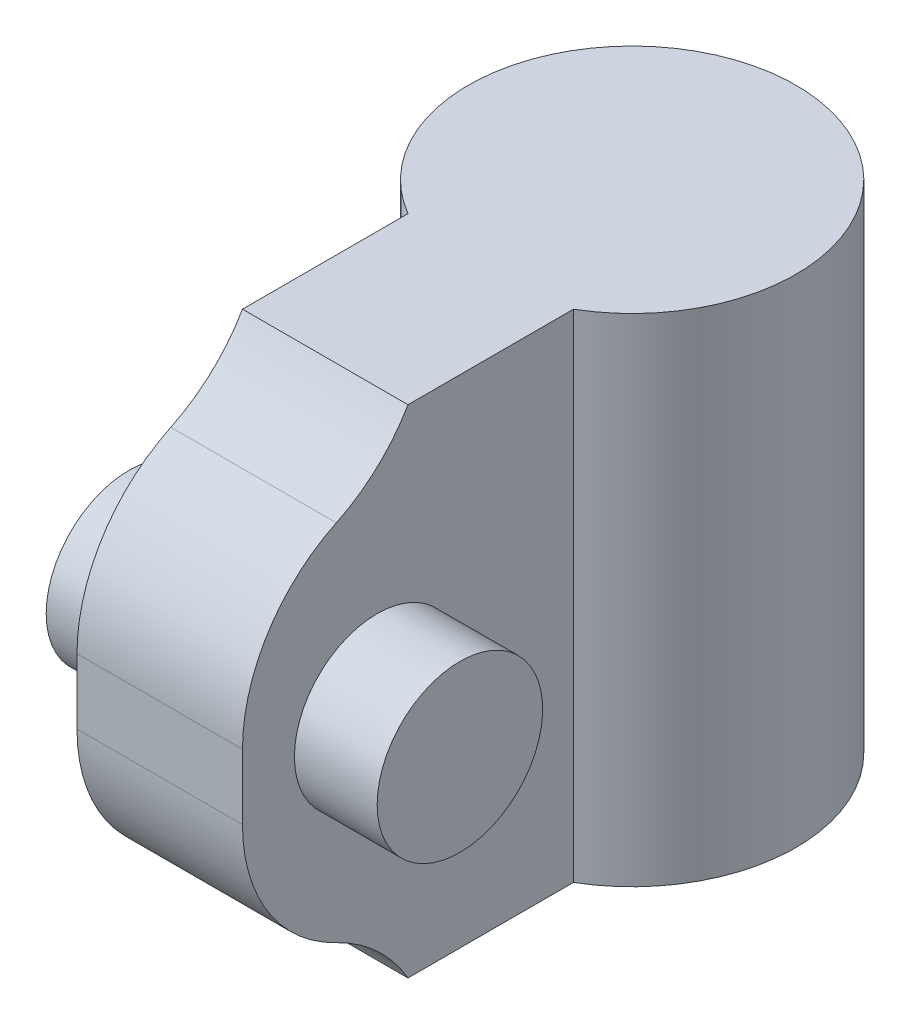
ISO-10303-21;
HEADER;
FILE_DESCRIPTION(('STEP AP214'),'2;1');
FILE_NAME('part.step','',(''),(''),'','','');
FILE_SCHEMA(('AUTOMOTIVE_DESIGN { 1 0 10303 214 1 1 1 1 }'));
ENDSEC;
DATA;
#1=APPLICATION_CONTEXT('core data for automotive mechanical design processes');
#2=APPLICATION_PROTOCOL_DEFINITION('international standard','automotive_design',2000,#1);
#3=PRODUCT_CONTEXT('',#1,'mechanical');
#4=PRODUCT('Part','Part','',(#3));
#5=PRODUCT_RELATED_PRODUCT_CATEGORY('part','',(#4));
#6=PRODUCT_DEFINITION_FORMATION('','',#4);
#7=PRODUCT_DEFINITION_CONTEXT('part definition',#1,'design');
#8=PRODUCT_DEFINITION('design','',#6,#7);
#9=PRODUCT_DEFINITION_SHAPE('','',#8);
#10=(LENGTH_UNIT() NAMED_UNIT(*) SI_UNIT(.MILLI.,.METRE.));
#11=(NAMED_UNIT(*) PLANE_ANGLE_UNIT() SI_UNIT($,.RADIAN.));
#12=(NAMED_UNIT(*) SI_UNIT($,.STERADIAN.) SOLID_ANGLE_UNIT());
#13=UNCERTAINTY_MEASURE_WITH_UNIT(LENGTH_MEASURE(1.E-05),#10,'distance_accuracy_value','');
#14=(GEOMETRIC_REPRESENTATION_CONTEXT(3) GLOBAL_UNCERTAINTY_ASSIGNED_CONTEXT((#13)) GLOBAL_UNIT_ASSIGNED_CONTEXT((#10,
#11,#12)) REPRESENTATION_CONTEXT('',''));
#15=CARTESIAN_POINT('',(0.,0.,0.));
#16=DIRECTION('',(0.,0.,1.));
#17=DIRECTION('',(1.,0.,0.));
#18=AXIS2_PLACEMENT_3D('',#15,#16,#17);
#19=CARTESIAN_POINT('',(2.5,0.,14.2722944655068));
#20=DIRECTION('',(0.,0.,1.));
#21=DIRECTION('',(1.,0.,0.));
#22=AXIS2_PLACEMENT_3D('',#19,#20,#21);
#23=PLANE('',#22);
#24=DIRECTION('',(0.,-1.,0.));
#25=VECTOR('',#24,1.);
#26=CARTESIAN_POINT('',(2.5,0.,14.2722944655068));
#27=LINE('',#26,#25);
#28=CARTESIAN_POINT('',(2.5,-6.51387818865997,14.2722944655068));
#29=VERTEX_POINT('',#28);
#30=CARTESIAN_POINT('',(2.5,-8.48612181134003,14.2722944655068));
#31=VERTEX_POINT('',#30);
#32=EDGE_CURVE('E155',#29,#31,#27,.T.);
#33=ORIENTED_EDGE('',*,*,#32,.F.);
#34=DIRECTION('',(1.,0.,0.));
#35=VECTOR('',#34,1.);
#36=CARTESIAN_POINT('',(-4.95,-6.51387818865997,14.2722944655068));
#37=LINE('',#36,#35);
#38=CARTESIAN_POINT('',(-2.5,-6.51387818865997,14.2722944655068));
#39=VERTEX_POINT('',#38);
#40=EDGE_CURVE('E109',#39,#29,#37,.T.);
#41=ORIENTED_EDGE('',*,*,#40,.F.);
#42=DIRECTION('',(0.,-1.,0.));
#43=VECTOR('',#42,1.);
#44=CARTESIAN_POINT('',(-2.5,0.,14.2722944655068));
#45=LINE('',#44,#43);
#46=CARTESIAN_POINT('',(-2.5,-8.48612181134003,14.2722944655068));
#47=VERTEX_POINT('',#46);
#48=EDGE_CURVE('E148',#39,#47,#45,.T.);
#49=ORIENTED_EDGE('',*,*,#48,.T.);
#50=DIRECTION('',(1.,0.,0.));
#51=VECTOR('',#50,1.);
#52=CARTESIAN_POINT('',(-4.95,-8.48612181134003,14.2722944655068));
#53=LINE('',#52,#51);
#54=EDGE_CURVE('E135',#47,#31,#53,.T.);
#55=ORIENTED_EDGE('',*,*,#54,.T.);
#56=EDGE_LOOP('',(#33,#41,#49,#55));
#57=FACE_BOUND('',#56,.T.);
#58=ADVANCED_FACE('F39',(#57),#23,.T.);
#59=CARTESIAN_POINT('',(2.5,0.,4.27229446550679));
#60=DIRECTION('',(1.,0.,0.));
#61=DIRECTION('',(0.,0.,-1.));
#62=AXIS2_PLACEMENT_3D('',#59,#60,#61);
#63=PLANE('',#62);
#64=CARTESIAN_POINT('',(2.5,-7.5,10.203329527437));
#65=DIRECTION('',(1.,0.,0.));
#66=DIRECTION('',(0.,0.,-1.));
#67=AXIS2_PLACEMENT_3D('',#64,#65,#66);
#68=CIRCLE('',#67,2.5);
#69=CARTESIAN_POINT('',(2.5,-7.5,7.70332952743702));
#70=VERTEX_POINT('',#69);
#71=EDGE_CURVE('E11',#70,#70,#68,.T.);
#72=ORIENTED_EDGE('',*,*,#71,.F.);
#73=EDGE_LOOP('',(#72));
#74=FACE_BOUND('',#73,.T.);
#75=CARTESIAN_POINT('',(2.5,-6.51387818865997,9.2722944655068));
#76=DIRECTION('',(-1.,0.,0.));
#77=DIRECTION('',(0.,0.,1.));
#78=AXIS2_PLACEMENT_3D('',#75,#76,#77);
#79=CIRCLE('',#78,5.);
#80=CARTESIAN_POINT('',(2.5,-2.00693909432999,11.4373579749679));
#81=VERTEX_POINT('',#80);
#82=EDGE_CURVE('E112',#29,#81,#79,.T.);
#83=ORIENTED_EDGE('',*,*,#82,.F.);
#84=ORIENTED_EDGE('',*,*,#32,.T.);
#85=CARTESIAN_POINT('',(2.5,-8.48612181134003,9.2722944655068));
#86=DIRECTION('',(-1.,0.,0.));
#87=DIRECTION('',(0.,0.,1.));
#88=AXIS2_PLACEMENT_3D('',#85,#86,#87);
#89=CIRCLE('',#88,4.99999999999999);
#90=CARTESIAN_POINT('',(2.5,-12.99306090567,11.4373579749679));
#91=VERTEX_POINT('',#90);
#92=EDGE_CURVE('E131',#91,#31,#89,.T.);
#93=ORIENTED_EDGE('',*,*,#92,.F.);
#94=CARTESIAN_POINT('',(2.5,-17.5,13.602421484429));
#95=DIRECTION('',(1.,0.,0.));
#96=DIRECTION('',(0.,0.,-1.));
#97=AXIS2_PLACEMENT_3D('',#94,#95,#96);
#98=CIRCLE('',#97,5.00000000000001);
#99=CARTESIAN_POINT('',(2.5,-15.,9.2722944655068));
#100=VERTEX_POINT('',#99);
#101=EDGE_CURVE('E128',#100,#91,#98,.T.);
#102=ORIENTED_EDGE('',*,*,#101,.F.);
#103=DIRECTION('',(0.,0.,1.));
#104=VECTOR('',#103,1.);
#105=CARTESIAN_POINT('',(2.5,-15.,4.27229446550679));
#106=LINE('',#105,#104);
#107=CARTESIAN_POINT('',(2.5,-15.,4.2722944655068));
#108=VERTEX_POINT('',#107);
#109=EDGE_CURVE('E144',#108,#100,#106,.T.);
#110=ORIENTED_EDGE('',*,*,#109,.F.);
#111=DIRECTION('',(0.,-1.,0.));
#112=VECTOR('',#111,1.);
#113=CARTESIAN_POINT('',(2.5,0.,4.2722944655068));
#114=LINE('',#113,#112);
#115=CARTESIAN_POINT('',(2.5,0.,4.2722944655068));
#116=VERTEX_POINT('',#115);
#117=EDGE_CURVE('E158',#116,#108,#114,.T.);
#118=ORIENTED_EDGE('',*,*,#117,.F.);
#119=DIRECTION('',(0.,0.,1.));
#120=VECTOR('',#119,1.);
#121=CARTESIAN_POINT('',(2.5,0.,4.27229446550679));
#122=LINE('',#121,#120);
#123=CARTESIAN_POINT('',(2.5,0.,9.2722944655068));
#124=VERTEX_POINT('',#123);
#125=EDGE_CURVE('E122',#116,#124,#122,.T.);
#126=ORIENTED_EDGE('',*,*,#125,.T.);
#127=CARTESIAN_POINT('',(2.5,2.5,13.602421484429));
#128=DIRECTION('',(1.,0.,0.));
#129=DIRECTION('',(0.,0.,-1.));
#130=AXIS2_PLACEMENT_3D('',#127,#128,#129);
#131=CIRCLE('',#130,5.);
#132=EDGE_CURVE('E53',#81,#124,#131,.T.);
#133=ORIENTED_EDGE('',*,*,#132,.F.);
#134=EDGE_LOOP('',(#83,#84,#93,#102,#110,#118,#126,#133));
#135=FACE_BOUND('',#134,.T.);
#136=ADVANCED_FACE('F120',(#74,#135),#63,.T.);
#137=CARTESIAN_POINT('',(0.,0.,0.));
#138=DIRECTION('',(0.,-1.,0.));
#139=DIRECTION('',(0.,0.,-1.));
#140=AXIS2_PLACEMENT_3D('',#137,#138,#139);
#141=CYLINDRICAL_SURFACE('',#140,4.95);
#142=CARTESIAN_POINT('',(0.,-15.,0.));
#143=DIRECTION('',(0.,-1.,0.));
#144=DIRECTION('',(0.,0.,-1.));
#145=AXIS2_PLACEMENT_3D('',#142,#143,#144);
#146=CIRCLE('',#145,4.95);
#147=CARTESIAN_POINT('',(-2.5,-15.,4.27229446550679));
#148=VERTEX_POINT('',#147);
#149=EDGE_CURVE('E150',#148,#108,#146,.T.);
#150=ORIENTED_EDGE('',*,*,#149,.F.);
#151=DIRECTION('',(0.,-1.,0.));
#152=VECTOR('',#151,1.);
#153=CARTESIAN_POINT('',(-2.5,0.,4.27229446550679));
#154=LINE('',#153,#152);
#155=CARTESIAN_POINT('',(-2.5,0.,4.27229446550679));
#156=VERTEX_POINT('',#155);
#157=EDGE_CURVE('E160',#156,#148,#154,.T.);
#158=ORIENTED_EDGE('',*,*,#157,.F.);
#159=CARTESIAN_POINT('',(0.,0.,0.));
#160=DIRECTION('',(0.,-1.,0.));
#161=DIRECTION('',(0.,0.,-1.));
#162=AXIS2_PLACEMENT_3D('',#159,#160,#161);
#163=CIRCLE('',#162,4.95);
#164=EDGE_CURVE('E143',#156,#116,#163,.T.);
#165=ORIENTED_EDGE('',*,*,#164,.T.);
#166=ORIENTED_EDGE('',*,*,#117,.T.);
#167=EDGE_LOOP('',(#150,#158,#165,#166));
#168=FACE_BOUND('',#167,.T.);
#169=ADVANCED_FACE('F180',(#168),#141,.T.);
#170=CARTESIAN_POINT('',(-2.5,0.,14.2722944655068));
#171=DIRECTION('',(-1.,0.,0.));
#172=DIRECTION('',(0.,0.,1.));
#173=AXIS2_PLACEMENT_3D('',#170,#171,#172);
#174=PLANE('',#173);
#175=CARTESIAN_POINT('',(-2.5,-7.5,10.203329527437));
#176=DIRECTION('',(-1.,0.,0.));
#177=DIRECTION('',(0.,0.,1.));
#178=AXIS2_PLACEMENT_3D('',#175,#176,#177);
#179=CIRCLE('',#178,2.5);
#180=CARTESIAN_POINT('',(-2.5,-7.5,12.703329527437));
#181=VERTEX_POINT('',#180);
#182=EDGE_CURVE('E46',#181,#181,#179,.T.);
#183=ORIENTED_EDGE('',*,*,#182,.F.);
#184=EDGE_LOOP('',(#183));
#185=FACE_BOUND('',#184,.T.);
#186=CARTESIAN_POINT('',(-2.5,-6.51387818865997,9.2722944655068));
#187=DIRECTION('',(-1.,0.,0.));
#188=DIRECTION('',(0.,0.,1.));
#189=AXIS2_PLACEMENT_3D('',#186,#187,#188);
#190=CIRCLE('',#189,5.);
#191=CARTESIAN_POINT('',(-2.5,-2.00693909432999,11.4373579749679));
#192=VERTEX_POINT('',#191);
#193=EDGE_CURVE('E169',#192,#39,#190,.F.);
#194=ORIENTED_EDGE('',*,*,#193,.F.);
#195=CARTESIAN_POINT('',(-2.5,2.5,13.602421484429));
#196=DIRECTION('',(-1.,0.,0.));
#197=DIRECTION('',(0.,0.,1.));
#198=AXIS2_PLACEMENT_3D('',#195,#196,#197);
#199=CIRCLE('',#198,5.);
#200=CARTESIAN_POINT('',(-2.5,0.,9.2722944655068));
#201=VERTEX_POINT('',#200);
#202=EDGE_CURVE('E106',#201,#192,#199,.T.);
#203=ORIENTED_EDGE('',*,*,#202,.F.);
#204=DIRECTION('',(0.,0.,-1.));
#205=VECTOR('',#204,1.);
#206=CARTESIAN_POINT('',(-2.5,0.,14.2722944655068));
#207=LINE('',#206,#205);
#208=EDGE_CURVE('E141',#201,#156,#207,.T.);
#209=ORIENTED_EDGE('',*,*,#208,.T.);
#210=ORIENTED_EDGE('',*,*,#157,.T.);
#211=DIRECTION('',(0.,0.,-1.));
#212=VECTOR('',#211,1.);
#213=CARTESIAN_POINT('',(-2.5,-15.,14.2722944655068));
#214=LINE('',#213,#212);
#215=CARTESIAN_POINT('',(-2.5,-15.,9.27229446550679));
#216=VERTEX_POINT('',#215);
#217=EDGE_CURVE('E140',#216,#148,#214,.T.);
#218=ORIENTED_EDGE('',*,*,#217,.F.);
#219=CARTESIAN_POINT('',(-2.5,-17.5,13.602421484429));
#220=DIRECTION('',(-1.,0.,0.));
#221=DIRECTION('',(0.,0.,1.));
#222=AXIS2_PLACEMENT_3D('',#219,#220,#221);
#223=CIRCLE('',#222,5.00000000000001);
#224=CARTESIAN_POINT('',(-2.5,-12.99306090567,11.4373579749679));
#225=VERTEX_POINT('',#224);
#226=EDGE_CURVE('E61',#225,#216,#223,.T.);
#227=ORIENTED_EDGE('',*,*,#226,.F.);
#228=CARTESIAN_POINT('',(-2.5,-8.48612181134003,9.2722944655068));
#229=DIRECTION('',(-1.,0.,0.));
#230=DIRECTION('',(0.,0.,1.));
#231=AXIS2_PLACEMENT_3D('',#228,#229,#230);
#232=CIRCLE('',#231,4.99999999999999);
#233=EDGE_CURVE('E165',#47,#225,#232,.F.);
#234=ORIENTED_EDGE('',*,*,#233,.F.);
#235=ORIENTED_EDGE('',*,*,#48,.F.);
#236=EDGE_LOOP('',(#194,#203,#209,#210,#218,#227,#234,#235));
#237=FACE_BOUND('',#236,.T.);
#238=ADVANCED_FACE('F176',(#185,#237),#174,.T.);
#239=CARTESIAN_POINT('',(0.,0.,0.));
#240=DIRECTION('',(0.,-1.,0.));
#241=DIRECTION('',(0.,0.,-1.));
#242=AXIS2_PLACEMENT_3D('',#239,#240,#241);
#243=PLANE('',#242);
#244=ORIENTED_EDGE('',*,*,#208,.F.);
#245=DIRECTION('',(1.,0.,0.));
#246=VECTOR('',#245,1.);
#247=CARTESIAN_POINT('',(-4.95,0.,9.2722944655068));
#248=LINE('',#247,#246);
#249=EDGE_CURVE('E167',#201,#124,#248,.T.);
#250=ORIENTED_EDGE('',*,*,#249,.T.);
#251=ORIENTED_EDGE('',*,*,#125,.F.);
#252=ORIENTED_EDGE('',*,*,#164,.F.);
#253=EDGE_LOOP('',(#244,#250,#251,#252));
#254=FACE_BOUND('',#253,.T.);
#255=ADVANCED_FACE('F179',(#254),#243,.F.);
#256=CARTESIAN_POINT('',(0.,-15.,0.));
#257=DIRECTION('',(0.,-1.,0.));
#258=DIRECTION('',(0.,0.,-1.));
#259=AXIS2_PLACEMENT_3D('',#256,#257,#258);
#260=PLANE('',#259);
#261=DIRECTION('',(1.,0.,0.));
#262=VECTOR('',#261,1.);
#263=CARTESIAN_POINT('',(-4.95,-15.,9.27229446550679));
#264=LINE('',#263,#262);
#265=EDGE_CURVE('E157',#216,#100,#264,.T.);
#266=ORIENTED_EDGE('',*,*,#265,.F.);
#267=ORIENTED_EDGE('',*,*,#217,.T.);
#268=ORIENTED_EDGE('',*,*,#149,.T.);
#269=ORIENTED_EDGE('',*,*,#109,.T.);
#270=EDGE_LOOP('',(#266,#267,#268,#269));
#271=FACE_BOUND('',#270,.T.);
#272=ADVANCED_FACE('F193',(#271),#260,.T.);
#273=CARTESIAN_POINT('',(-4.95,-8.48612181134003,9.2722944655068));
#274=DIRECTION('',(1.,0.,0.));
#275=DIRECTION('',(0.,0.,-1.));
#276=AXIS2_PLACEMENT_3D('',#273,#274,#275);
#277=CYLINDRICAL_SURFACE('',#276,4.99999999999999);
#278=ORIENTED_EDGE('',*,*,#233,.T.);
#279=DIRECTION('',(1.,0.,0.));
#280=VECTOR('',#279,1.);
#281=CARTESIAN_POINT('',(-4.95,-12.99306090567,11.4373579749679));
#282=LINE('',#281,#280);
#283=EDGE_CURVE('E134',#225,#91,#282,.T.);
#284=ORIENTED_EDGE('',*,*,#283,.T.);
#285=ORIENTED_EDGE('',*,*,#92,.T.);
#286=ORIENTED_EDGE('',*,*,#54,.F.);
#287=EDGE_LOOP('',(#278,#284,#285,#286));
#288=FACE_BOUND('',#287,.T.);
#289=ADVANCED_FACE('F189',(#288),#277,.T.);
#290=CARTESIAN_POINT('',(-4.95,-17.5,13.602421484429));
#291=DIRECTION('',(1.,0.,0.));
#292=DIRECTION('',(0.,0.,-1.));
#293=AXIS2_PLACEMENT_3D('',#290,#291,#292);
#294=CYLINDRICAL_SURFACE('',#293,5.00000000000001);
#295=ORIENTED_EDGE('',*,*,#226,.T.);
#296=ORIENTED_EDGE('',*,*,#265,.T.);
#297=ORIENTED_EDGE('',*,*,#101,.T.);
#298=ORIENTED_EDGE('',*,*,#283,.F.);
#299=EDGE_LOOP('',(#295,#296,#297,#298));
#300=FACE_BOUND('',#299,.T.);
#301=ADVANCED_FACE('F190',(#300),#294,.F.);
#302=CARTESIAN_POINT('',(-4.95,-6.51387818865997,9.2722944655068));
#303=DIRECTION('',(1.,0.,0.));
#304=DIRECTION('',(0.,0.,-1.));
#305=AXIS2_PLACEMENT_3D('',#302,#303,#304);
#306=CYLINDRICAL_SURFACE('',#305,5.);
#307=ORIENTED_EDGE('',*,*,#193,.T.);
#308=ORIENTED_EDGE('',*,*,#40,.T.);
#309=ORIENTED_EDGE('',*,*,#82,.T.);
#310=DIRECTION('',(1.,0.,0.));
#311=VECTOR('',#310,1.);
#312=CARTESIAN_POINT('',(-4.95,-2.00693909432999,11.4373579749679));
#313=LINE('',#312,#311);
#314=EDGE_CURVE('E102',#192,#81,#313,.T.);
#315=ORIENTED_EDGE('',*,*,#314,.F.);
#316=EDGE_LOOP('',(#307,#308,#309,#315));
#317=FACE_BOUND('',#316,.T.);
#318=ADVANCED_FACE('F113',(#317),#306,.T.);
#319=CARTESIAN_POINT('',(-4.95,2.5,13.602421484429));
#320=DIRECTION('',(1.,0.,0.));
#321=DIRECTION('',(0.,0.,-1.));
#322=AXIS2_PLACEMENT_3D('',#319,#320,#321);
#323=CYLINDRICAL_SURFACE('',#322,5.);
#324=ORIENTED_EDGE('',*,*,#202,.T.);
#325=ORIENTED_EDGE('',*,*,#314,.T.);
#326=ORIENTED_EDGE('',*,*,#132,.T.);
#327=ORIENTED_EDGE('',*,*,#249,.F.);
#328=EDGE_LOOP('',(#324,#325,#326,#327));
#329=FACE_BOUND('',#328,.T.);
#330=ADVANCED_FACE('F104',(#329),#323,.F.);
#331=CARTESIAN_POINT('',(-2.5,-7.5,10.203329527437));
#332=DIRECTION('',(-1.,0.,0.));
#333=DIRECTION('',(0.,0.,1.));
#334=AXIS2_PLACEMENT_3D('',#331,#332,#333);
#335=CYLINDRICAL_SURFACE('',#334,2.5);
#336=ORIENTED_EDGE('',*,*,#182,.T.);
#337=EDGE_LOOP('',(#336));
#338=FACE_BOUND('',#337,.T.);
#339=CARTESIAN_POINT('',(-5.,-7.5,10.203329527437));
#340=DIRECTION('',(-1.,0.,0.));
#341=DIRECTION('',(0.,0.,1.));
#342=AXIS2_PLACEMENT_3D('',#339,#340,#341);
#343=CIRCLE('',#342,2.5);
#344=CARTESIAN_POINT('',(-5.,-7.5,12.703329527437));
#345=VERTEX_POINT('',#344);
#346=EDGE_CURVE('E117',#345,#345,#343,.T.);
#347=ORIENTED_EDGE('',*,*,#346,.F.);
#348=EDGE_LOOP('',(#347));
#349=FACE_BOUND('',#348,.T.);
#350=ADVANCED_FACE('F173',(#338,#349),#335,.T.);
#351=CARTESIAN_POINT('',(-5.,-7.5,10.203329527437));
#352=DIRECTION('',(-1.,0.,0.));
#353=DIRECTION('',(0.,0.,1.));
#354=AXIS2_PLACEMENT_3D('',#351,#352,#353);
#355=PLANE('',#354);
#356=ORIENTED_EDGE('',*,*,#346,.T.);
#357=EDGE_LOOP('',(#356));
#358=FACE_BOUND('',#357,.T.);
#359=ADVANCED_FACE('F222',(#358),#355,.T.);
#360=CARTESIAN_POINT('',(5.,-7.5,10.203329527437));
#361=DIRECTION('',(-1.,0.,0.));
#362=DIRECTION('',(0.,0.,1.));
#363=AXIS2_PLACEMENT_3D('',#360,#361,#362);
#364=CYLINDRICAL_SURFACE('',#363,2.5);
#365=CARTESIAN_POINT('',(5.,-7.5,10.203329527437));
#366=DIRECTION('',(-1.,0.,0.));
#367=DIRECTION('',(0.,0.,1.));
#368=AXIS2_PLACEMENT_3D('',#365,#366,#367);
#369=CIRCLE('',#368,2.5);
#370=CARTESIAN_POINT('',(5.,-7.5,12.703329527437));
#371=VERTEX_POINT('',#370);
#372=EDGE_CURVE('E320',#371,#371,#369,.T.);
#373=ORIENTED_EDGE('',*,*,#372,.T.);
#374=EDGE_LOOP('',(#373));
#375=FACE_BOUND('',#374,.T.);
#376=ORIENTED_EDGE('',*,*,#71,.T.);
#377=EDGE_LOOP('',(#376));
#378=FACE_BOUND('',#377,.T.);
#379=ADVANCED_FACE('F219',(#375,#378),#364,.T.);
#380=CARTESIAN_POINT('',(5.,-5.,10.203329527437));
#381=DIRECTION('',(1.,0.,0.));
#382=DIRECTION('',(0.,0.,-1.));
#383=AXIS2_PLACEMENT_3D('',#380,#381,#382);
#384=PLANE('',#383);
#385=ORIENTED_EDGE('',*,*,#372,.F.);
#386=EDGE_LOOP('',(#385));
#387=FACE_BOUND('',#386,.T.);
#388=ADVANCED_FACE('F221',(#387),#384,.T.);
#389=CLOSED_SHELL('',(#58,#136,#169,#238,#255,#272,#289,#301,#318,#330,#350,#359,#379,#388));
#390=MANIFOLD_SOLID_BREP('B2',#389);
#391=ADVANCED_BREP_SHAPE_REPRESENTATION('',(#18,#390),#14);
#392=SHAPE_DEFINITION_REPRESENTATION(#9,#391);
ENDSEC;
END-ISO-10303-21;
